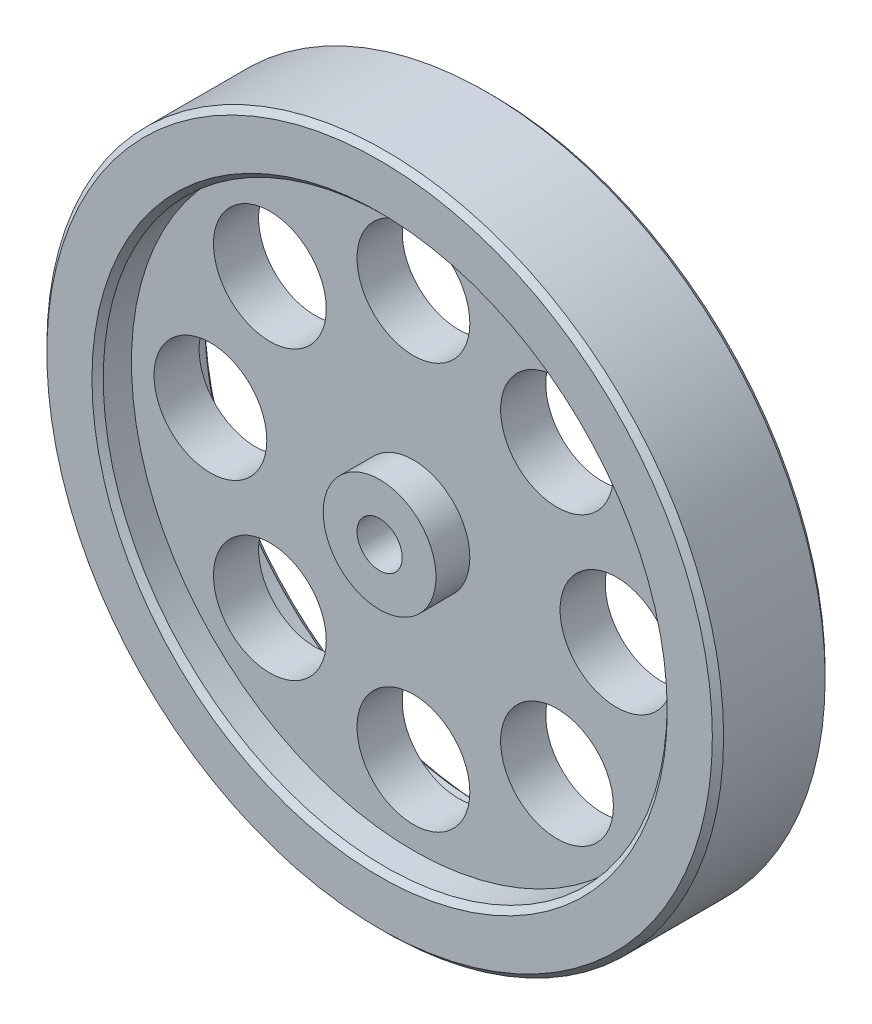
ISO-10303-21;
HEADER;
FILE_DESCRIPTION(('STEP AP214'),'2;1');
FILE_NAME('part.step','',(''),(''),'','','');
FILE_SCHEMA(('AUTOMOTIVE_DESIGN { 1 0 10303 214 1 1 1 1 }'));
ENDSEC;
DATA;
#1=APPLICATION_CONTEXT('core data for automotive mechanical design processes');
#2=APPLICATION_PROTOCOL_DEFINITION('international standard','automotive_design',2000,#1);
#3=PRODUCT_CONTEXT('',#1,'mechanical');
#4=PRODUCT('Part','Part','',(#3));
#5=PRODUCT_RELATED_PRODUCT_CATEGORY('part','',(#4));
#6=PRODUCT_DEFINITION_FORMATION('','',#4);
#7=PRODUCT_DEFINITION_CONTEXT('part definition',#1,'design');
#8=PRODUCT_DEFINITION('design','',#6,#7);
#9=PRODUCT_DEFINITION_SHAPE('','',#8);
#10=(LENGTH_UNIT() NAMED_UNIT(*) SI_UNIT(.MILLI.,.METRE.));
#11=(NAMED_UNIT(*) PLANE_ANGLE_UNIT() SI_UNIT($,.RADIAN.));
#12=(NAMED_UNIT(*) SI_UNIT($,.STERADIAN.) SOLID_ANGLE_UNIT());
#13=UNCERTAINTY_MEASURE_WITH_UNIT(LENGTH_MEASURE(1.E-05),#10,'distance_accuracy_value','');
#14=(GEOMETRIC_REPRESENTATION_CONTEXT(3) GLOBAL_UNCERTAINTY_ASSIGNED_CONTEXT((#13)) GLOBAL_UNIT_ASSIGNED_CONTEXT((#10,
#11,#12)) REPRESENTATION_CONTEXT('',''));
#15=CARTESIAN_POINT('',(0.,0.,0.));
#16=DIRECTION('',(0.,0.,1.));
#17=DIRECTION('',(1.,0.,0.));
#18=AXIS2_PLACEMENT_3D('',#15,#16,#17);
#19=CARTESIAN_POINT('',(0.,0.,5.));
#20=DIRECTION('',(0.,0.,-1.));
#21=DIRECTION('',(-1.,0.,0.));
#22=AXIS2_PLACEMENT_3D('',#19,#20,#21);
#23=CYLINDRICAL_SURFACE('',#22,25.);
#24=CARTESIAN_POINT('',(0.,0.,-4.5));
#25=DIRECTION('',(0.,0.,1.));
#26=DIRECTION('',(1.,0.,0.));
#27=AXIS2_PLACEMENT_3D('',#24,#25,#26);
#28=CIRCLE('',#27,25.);
#29=CARTESIAN_POINT('',(25.,0.,-4.5));
#30=VERTEX_POINT('',#29);
#31=EDGE_CURVE('E10',#30,#30,#28,.F.);
#32=ORIENTED_EDGE('',*,*,#31,.T.);
#33=EDGE_LOOP('',(#32));
#34=FACE_BOUND('',#33,.T.);
#35=CARTESIAN_POINT('',(0.,0.,-2.));
#36=DIRECTION('',(0.,0.,1.));
#37=DIRECTION('',(1.,0.,0.));
#38=AXIS2_PLACEMENT_3D('',#35,#36,#37);
#39=CIRCLE('',#38,25.);
#40=CARTESIAN_POINT('',(25.,0.,-2.));
#41=VERTEX_POINT('',#40);
#42=EDGE_CURVE('E102',#41,#41,#39,.T.);
#43=ORIENTED_EDGE('',*,*,#42,.T.);
#44=EDGE_LOOP('',(#43));
#45=FACE_BOUND('',#44,.T.);
#46=ADVANCED_FACE('F33',(#34,#45),#23,.F.);
#47=CARTESIAN_POINT('',(0.,0.,5.));
#48=DIRECTION('',(0.,0.,1.));
#49=DIRECTION('',(1.,0.,0.));
#50=AXIS2_PLACEMENT_3D('',#47,#48,#49);
#51=PLANE('',#50);
#52=CARTESIAN_POINT('',(0.,0.,5.));
#53=DIRECTION('',(0.,0.,1.));
#54=DIRECTION('',(1.,0.,0.));
#55=AXIS2_PLACEMENT_3D('',#52,#53,#54);
#56=CIRCLE('',#55,25.5);
#57=CARTESIAN_POINT('',(25.5,0.,5.));
#58=VERTEX_POINT('',#57);
#59=EDGE_CURVE('E57',#58,#58,#56,.F.);
#60=ORIENTED_EDGE('',*,*,#59,.T.);
#61=EDGE_LOOP('',(#60));
#62=FACE_BOUND('',#61,.T.);
#63=CARTESIAN_POINT('',(0.,0.,5.));
#64=DIRECTION('',(0.,0.,1.));
#65=DIRECTION('',(1.,0.,0.));
#66=AXIS2_PLACEMENT_3D('',#63,#64,#65);
#67=CIRCLE('',#66,29.5);
#68=CARTESIAN_POINT('',(29.5,0.,5.));
#69=VERTEX_POINT('',#68);
#70=EDGE_CURVE('E60',#69,#69,#67,.T.);
#71=ORIENTED_EDGE('',*,*,#70,.T.);
#72=EDGE_LOOP('',(#71));
#73=FACE_BOUND('',#72,.T.);
#74=ADVANCED_FACE('F160',(#62,#73),#51,.T.);
#75=CARTESIAN_POINT('',(0.,0.,-5.));
#76=DIRECTION('',(0.,0.,1.));
#77=DIRECTION('',(1.,0.,0.));
#78=AXIS2_PLACEMENT_3D('',#75,#76,#77);
#79=PLANE('',#78);
#80=CARTESIAN_POINT('',(0.,0.,-5.));
#81=DIRECTION('',(0.,0.,1.));
#82=DIRECTION('',(1.,0.,0.));
#83=AXIS2_PLACEMENT_3D('',#80,#81,#82);
#84=CIRCLE('',#83,25.5);
#85=CARTESIAN_POINT('',(25.5,0.,-5.));
#86=VERTEX_POINT('',#85);
#87=EDGE_CURVE('E41',#86,#86,#84,.T.);
#88=ORIENTED_EDGE('',*,*,#87,.T.);
#89=EDGE_LOOP('',(#88));
#90=FACE_BOUND('',#89,.T.);
#91=CARTESIAN_POINT('',(0.,0.,-5.));
#92=DIRECTION('',(0.,0.,1.));
#93=DIRECTION('',(1.,0.,0.));
#94=AXIS2_PLACEMENT_3D('',#91,#92,#93);
#95=CIRCLE('',#94,29.5);
#96=CARTESIAN_POINT('',(29.5,0.,-5.));
#97=VERTEX_POINT('',#96);
#98=EDGE_CURVE('E45',#97,#97,#95,.F.);
#99=ORIENTED_EDGE('',*,*,#98,.T.);
#100=EDGE_LOOP('',(#99));
#101=FACE_BOUND('',#100,.T.);
#102=ADVANCED_FACE('F166',(#90,#101),#79,.F.);
#103=CARTESIAN_POINT('',(0.,0.,5.));
#104=DIRECTION('',(0.,0.,-1.));
#105=DIRECTION('',(-1.,0.,0.));
#106=AXIS2_PLACEMENT_3D('',#103,#104,#105);
#107=CYLINDRICAL_SURFACE('',#106,30.);
#108=CARTESIAN_POINT('',(0.,0.,4.50000000000002));
#109=DIRECTION('',(0.,0.,1.));
#110=DIRECTION('',(1.,0.,0.));
#111=AXIS2_PLACEMENT_3D('',#108,#109,#110);
#112=CIRCLE('',#111,30.);
#113=CARTESIAN_POINT('',(30.,0.,4.50000000000002));
#114=VERTEX_POINT('',#113);
#115=EDGE_CURVE('E49',#114,#114,#112,.F.);
#116=ORIENTED_EDGE('',*,*,#115,.T.);
#117=EDGE_LOOP('',(#116));
#118=FACE_BOUND('',#117,.T.);
#119=CARTESIAN_POINT('',(0.,0.,-4.5));
#120=DIRECTION('',(0.,0.,1.));
#121=DIRECTION('',(1.,0.,0.));
#122=AXIS2_PLACEMENT_3D('',#119,#120,#121);
#123=CIRCLE('',#122,30.);
#124=CARTESIAN_POINT('',(30.,0.,-4.5));
#125=VERTEX_POINT('',#124);
#126=EDGE_CURVE('E54',#125,#125,#123,.T.);
#127=ORIENTED_EDGE('',*,*,#126,.T.);
#128=EDGE_LOOP('',(#127));
#129=FACE_BOUND('',#128,.T.);
#130=ADVANCED_FACE('F172',(#118,#129),#107,.T.);
#131=CARTESIAN_POINT('',(0.,0.,4.5));
#132=DIRECTION('',(0.,0.,1.));
#133=DIRECTION('',(1.,0.,0.));
#134=AXIS2_PLACEMENT_3D('',#131,#132,#133);
#135=CIRCLE('',#134,25.);
#136=CARTESIAN_POINT('',(25.,0.,4.5));
#137=VERTEX_POINT('',#136);
#138=EDGE_CURVE('E63',#137,#137,#135,.T.);
#139=ORIENTED_EDGE('',*,*,#138,.T.);
#140=EDGE_LOOP('',(#139));
#141=FACE_BOUND('',#140,.T.);
#142=CARTESIAN_POINT('',(0.,0.,2.));
#143=DIRECTION('',(0.,0.,1.));
#144=DIRECTION('',(1.,0.,0.));
#145=AXIS2_PLACEMENT_3D('',#142,#143,#144);
#146=CIRCLE('',#145,25.);
#147=CARTESIAN_POINT('',(25.,0.,2.));
#148=VERTEX_POINT('',#147);
#149=EDGE_CURVE('E66',#148,#148,#146,.T.);
#150=ORIENTED_EDGE('',*,*,#149,.F.);
#151=EDGE_LOOP('',(#150));
#152=FACE_BOUND('',#151,.T.);
#153=ADVANCED_FACE('F162',(#141,#152),#23,.F.);
#154=CARTESIAN_POINT('',(0.,0.,-2.));
#155=DIRECTION('',(0.,0.,1.));
#156=DIRECTION('',(1.,0.,0.));
#157=AXIS2_PLACEMENT_3D('',#154,#155,#156);
#158=PLANE('',#157);
#159=CARTESIAN_POINT('',(12.7279220613574,12.7279220613568,-2.));
#160=DIRECTION('',(0.,0.,1.));
#161=DIRECTION('',(1.,0.,0.));
#162=AXIS2_PLACEMENT_3D('',#159,#160,#161);
#163=CIRCLE('',#162,5.00000000000096);
#164=CARTESIAN_POINT('',(17.7279220613584,12.7279220613568,-2.));
#165=VERTEX_POINT('',#164);
#166=EDGE_CURVE('E70',#165,#165,#163,.T.);
#167=ORIENTED_EDGE('',*,*,#166,.T.);
#168=EDGE_LOOP('',(#167));
#169=FACE_BOUND('',#168,.T.);
#170=CARTESIAN_POINT('',(17.9999999999985,-1.53367012712258E-12,-2.));
#171=DIRECTION('',(0.,0.,1.));
#172=DIRECTION('',(1.,0.,0.));
#173=AXIS2_PLACEMENT_3D('',#170,#171,#172);
#174=CIRCLE('',#173,5.0000000000021);
#175=CARTESIAN_POINT('',(23.0000000000006,-1.53367012712258E-12,-2.));
#176=VERTEX_POINT('',#175);
#177=EDGE_CURVE('E71',#176,#176,#174,.T.);
#178=ORIENTED_EDGE('',*,*,#177,.T.);
#179=EDGE_LOOP('',(#178));
#180=FACE_BOUND('',#179,.T.);
#181=CARTESIAN_POINT('',(12.7279220613552,-12.7279220613589,-2.));
#182=DIRECTION('',(0.,0.,1.));
#183=DIRECTION('',(1.,0.,0.));
#184=AXIS2_PLACEMENT_3D('',#181,#182,#183);
#185=CIRCLE('',#184,5.00000000000297);
#186=CARTESIAN_POINT('',(17.7279220613582,-12.7279220613589,-2.));
#187=VERTEX_POINT('',#186);
#188=EDGE_CURVE('E75',#187,#187,#185,.T.);
#189=ORIENTED_EDGE('',*,*,#188,.T.);
#190=EDGE_LOOP('',(#189));
#191=FACE_BOUND('',#190,.T.);
#192=CARTESIAN_POINT('',(-3.06293152576824E-12,-18.,-2.));
#193=DIRECTION('',(0.,0.,1.));
#194=DIRECTION('',(1.,0.,0.));
#195=AXIS2_PLACEMENT_3D('',#192,#193,#194);
#196=CIRCLE('',#195,5.00000000000305);
#197=CARTESIAN_POINT('',(4.99999999999999,-18.,-2.));
#198=VERTEX_POINT('',#197);
#199=EDGE_CURVE('E79',#198,#198,#196,.T.);
#200=ORIENTED_EDGE('',*,*,#199,.T.);
#201=EDGE_LOOP('',(#200));
#202=FACE_BOUND('',#201,.T.);
#203=CARTESIAN_POINT('',(-12.7279220613605,-12.7279220613568,-2.));
#204=DIRECTION('',(0.,0.,1.));
#205=DIRECTION('',(1.,0.,0.));
#206=AXIS2_PLACEMENT_3D('',#203,#204,#205);
#207=CIRCLE('',#206,5.00000000000228);
#208=CARTESIAN_POINT('',(-7.72792206135819,-12.7279220613568,-2.));
#209=VERTEX_POINT('',#208);
#210=EDGE_CURVE('E83',#209,#209,#207,.T.);
#211=ORIENTED_EDGE('',*,*,#210,.T.);
#212=EDGE_LOOP('',(#211));
#213=FACE_BOUND('',#212,.T.);
#214=CARTESIAN_POINT('',(-18.0000000000015,1.53146576288412E-12,-2.));
#215=DIRECTION('',(0.,0.,1.));
#216=DIRECTION('',(1.,0.,0.));
#217=AXIS2_PLACEMENT_3D('',#214,#215,#216);
#218=CIRCLE('',#217,5.00000000000108);
#219=CARTESIAN_POINT('',(-13.0000000000005,1.53146576288412E-12,-2.));
#220=VERTEX_POINT('',#219);
#221=EDGE_CURVE('E87',#220,#220,#218,.T.);
#222=ORIENTED_EDGE('',*,*,#221,.T.);
#223=EDGE_LOOP('',(#222));
#224=FACE_BOUND('',#223,.T.);
#225=CARTESIAN_POINT('',(-12.7279220613583,12.7279220613589,-2.));
#226=DIRECTION('',(0.,0.,1.));
#227=DIRECTION('',(1.,0.,0.));
#228=AXIS2_PLACEMENT_3D('',#225,#226,#227);
#229=CIRCLE('',#228,5.00000000000015);
#230=CARTESIAN_POINT('',(-7.72792206135815,12.7279220613589,-2.));
#231=VERTEX_POINT('',#230);
#232=EDGE_CURVE('E91',#231,#231,#229,.T.);
#233=ORIENTED_EDGE('',*,*,#232,.T.);
#234=EDGE_LOOP('',(#233));
#235=FACE_BOUND('',#234,.T.);
#236=CARTESIAN_POINT('',(0.,18.,-2.));
#237=DIRECTION('',(0.,0.,1.));
#238=DIRECTION('',(1.,0.,0.));
#239=AXIS2_PLACEMENT_3D('',#236,#237,#238);
#240=CIRCLE('',#239,5.);
#241=CARTESIAN_POINT('',(5.,18.,-2.));
#242=VERTEX_POINT('',#241);
#243=EDGE_CURVE('E95',#242,#242,#240,.T.);
#244=ORIENTED_EDGE('',*,*,#243,.T.);
#245=EDGE_LOOP('',(#244));
#246=FACE_BOUND('',#245,.T.);
#247=CARTESIAN_POINT('',(0.,0.,-2.));
#248=DIRECTION('',(0.,0.,1.));
#249=DIRECTION('',(1.,0.,0.));
#250=AXIS2_PLACEMENT_3D('',#247,#248,#249);
#251=CIRCLE('',#250,5.);
#252=CARTESIAN_POINT('',(5.,0.,-2.));
#253=VERTEX_POINT('',#252);
#254=EDGE_CURVE('E103',#253,#253,#251,.T.);
#255=ORIENTED_EDGE('',*,*,#254,.T.);
#256=EDGE_LOOP('',(#255));
#257=FACE_BOUND('',#256,.T.);
#258=ORIENTED_EDGE('',*,*,#42,.F.);
#259=EDGE_LOOP('',(#258));
#260=FACE_BOUND('',#259,.T.);
#261=ADVANCED_FACE('F139',(#169,#180,#191,#202,#213,#224,#235,#246,#257,#260),#158,.F.);
#262=CARTESIAN_POINT('',(0.,0.,2.));
#263=DIRECTION('',(0.,0.,1.));
#264=DIRECTION('',(1.,0.,0.));
#265=AXIS2_PLACEMENT_3D('',#262,#263,#264);
#266=PLANE('',#265);
#267=CARTESIAN_POINT('',(12.7279220613574,12.7279220613568,2.));
#268=DIRECTION('',(0.,0.,1.));
#269=DIRECTION('',(1.,0.,0.));
#270=AXIS2_PLACEMENT_3D('',#267,#268,#269);
#271=CIRCLE('',#270,5.00000000000096);
#272=CARTESIAN_POINT('',(17.7279220613584,12.7279220613568,2.));
#273=VERTEX_POINT('',#272);
#274=EDGE_CURVE('E67',#273,#273,#271,.T.);
#275=ORIENTED_EDGE('',*,*,#274,.F.);
#276=EDGE_LOOP('',(#275));
#277=FACE_BOUND('',#276,.T.);
#278=CARTESIAN_POINT('',(17.9999999999985,-1.53367012712258E-12,2.));
#279=DIRECTION('',(0.,0.,1.));
#280=DIRECTION('',(1.,0.,0.));
#281=AXIS2_PLACEMENT_3D('',#278,#279,#280);
#282=CIRCLE('',#281,5.0000000000021);
#283=CARTESIAN_POINT('',(23.0000000000006,-1.53367012712258E-12,2.));
#284=VERTEX_POINT('',#283);
#285=EDGE_CURVE('E72',#284,#284,#282,.T.);
#286=ORIENTED_EDGE('',*,*,#285,.F.);
#287=EDGE_LOOP('',(#286));
#288=FACE_BOUND('',#287,.T.);
#289=CARTESIAN_POINT('',(12.7279220613552,-12.7279220613589,2.));
#290=DIRECTION('',(0.,0.,1.));
#291=DIRECTION('',(1.,0.,0.));
#292=AXIS2_PLACEMENT_3D('',#289,#290,#291);
#293=CIRCLE('',#292,5.00000000000297);
#294=CARTESIAN_POINT('',(17.7279220613582,-12.7279220613589,2.));
#295=VERTEX_POINT('',#294);
#296=EDGE_CURVE('E76',#295,#295,#293,.T.);
#297=ORIENTED_EDGE('',*,*,#296,.F.);
#298=EDGE_LOOP('',(#297));
#299=FACE_BOUND('',#298,.T.);
#300=CARTESIAN_POINT('',(-3.06293152576824E-12,-18.,2.));
#301=DIRECTION('',(0.,0.,1.));
#302=DIRECTION('',(1.,0.,0.));
#303=AXIS2_PLACEMENT_3D('',#300,#301,#302);
#304=CIRCLE('',#303,5.00000000000305);
#305=CARTESIAN_POINT('',(4.99999999999999,-18.,2.));
#306=VERTEX_POINT('',#305);
#307=EDGE_CURVE('E80',#306,#306,#304,.T.);
#308=ORIENTED_EDGE('',*,*,#307,.F.);
#309=EDGE_LOOP('',(#308));
#310=FACE_BOUND('',#309,.T.);
#311=CARTESIAN_POINT('',(-12.7279220613605,-12.7279220613568,2.));
#312=DIRECTION('',(0.,0.,1.));
#313=DIRECTION('',(1.,0.,0.));
#314=AXIS2_PLACEMENT_3D('',#311,#312,#313);
#315=CIRCLE('',#314,5.00000000000228);
#316=CARTESIAN_POINT('',(-7.72792206135819,-12.7279220613568,2.));
#317=VERTEX_POINT('',#316);
#318=EDGE_CURVE('E84',#317,#317,#315,.T.);
#319=ORIENTED_EDGE('',*,*,#318,.F.);
#320=EDGE_LOOP('',(#319));
#321=FACE_BOUND('',#320,.T.);
#322=CARTESIAN_POINT('',(-18.0000000000015,1.53146576288412E-12,2.));
#323=DIRECTION('',(0.,0.,1.));
#324=DIRECTION('',(1.,0.,0.));
#325=AXIS2_PLACEMENT_3D('',#322,#323,#324);
#326=CIRCLE('',#325,5.00000000000108);
#327=CARTESIAN_POINT('',(-13.0000000000005,1.53146576288412E-12,2.));
#328=VERTEX_POINT('',#327);
#329=EDGE_CURVE('E88',#328,#328,#326,.T.);
#330=ORIENTED_EDGE('',*,*,#329,.F.);
#331=EDGE_LOOP('',(#330));
#332=FACE_BOUND('',#331,.T.);
#333=CARTESIAN_POINT('',(-12.7279220613583,12.7279220613589,2.));
#334=DIRECTION('',(0.,0.,1.));
#335=DIRECTION('',(1.,0.,0.));
#336=AXIS2_PLACEMENT_3D('',#333,#334,#335);
#337=CIRCLE('',#336,5.00000000000015);
#338=CARTESIAN_POINT('',(-7.72792206135815,12.7279220613589,2.));
#339=VERTEX_POINT('',#338);
#340=EDGE_CURVE('E92',#339,#339,#337,.T.);
#341=ORIENTED_EDGE('',*,*,#340,.F.);
#342=EDGE_LOOP('',(#341));
#343=FACE_BOUND('',#342,.T.);
#344=CARTESIAN_POINT('',(0.,18.,2.));
#345=DIRECTION('',(0.,0.,1.));
#346=DIRECTION('',(1.,0.,0.));
#347=AXIS2_PLACEMENT_3D('',#344,#345,#346);
#348=CIRCLE('',#347,5.);
#349=CARTESIAN_POINT('',(5.,18.,2.));
#350=VERTEX_POINT('',#349);
#351=EDGE_CURVE('E96',#350,#350,#348,.T.);
#352=ORIENTED_EDGE('',*,*,#351,.F.);
#353=EDGE_LOOP('',(#352));
#354=FACE_BOUND('',#353,.T.);
#355=CARTESIAN_POINT('',(0.,0.,2.));
#356=DIRECTION('',(0.,0.,1.));
#357=DIRECTION('',(1.,0.,0.));
#358=AXIS2_PLACEMENT_3D('',#355,#356,#357);
#359=CIRCLE('',#358,5.);
#360=CARTESIAN_POINT('',(5.,0.,2.));
#361=VERTEX_POINT('',#360);
#362=EDGE_CURVE('E99',#361,#361,#359,.T.);
#363=ORIENTED_EDGE('',*,*,#362,.F.);
#364=EDGE_LOOP('',(#363));
#365=FACE_BOUND('',#364,.T.);
#366=ORIENTED_EDGE('',*,*,#149,.T.);
#367=EDGE_LOOP('',(#366));
#368=FACE_BOUND('',#367,.T.);
#369=ADVANCED_FACE('F178',(#277,#288,#299,#310,#321,#332,#343,#354,#365,#368),#266,.T.);
#370=CARTESIAN_POINT('',(0.,0.,5.));
#371=DIRECTION('',(0.,0.,-1.));
#372=DIRECTION('',(-1.,0.,0.));
#373=AXIS2_PLACEMENT_3D('',#370,#371,#372);
#374=CYLINDRICAL_SURFACE('',#373,5.);
#375=CARTESIAN_POINT('',(0.,0.,-5.));
#376=DIRECTION('',(0.,0.,-1.));
#377=DIRECTION('',(-1.,0.,0.));
#378=AXIS2_PLACEMENT_3D('',#375,#376,#377);
#379=CIRCLE('',#378,5.);
#380=CARTESIAN_POINT('',(-5.,0.,-5.));
#381=VERTEX_POINT('',#380);
#382=EDGE_CURVE('E116',#381,#381,#379,.T.);
#383=ORIENTED_EDGE('',*,*,#382,.F.);
#384=EDGE_LOOP('',(#383));
#385=FACE_BOUND('',#384,.T.);
#386=ORIENTED_EDGE('',*,*,#254,.F.);
#387=EDGE_LOOP('',(#386));
#388=FACE_BOUND('',#387,.T.);
#389=ADVANCED_FACE('F187',(#385,#388),#374,.T.);
#390=ORIENTED_EDGE('',*,*,#362,.T.);
#391=EDGE_LOOP('',(#390));
#392=FACE_BOUND('',#391,.T.);
#393=CARTESIAN_POINT('',(0.,0.,5.));
#394=DIRECTION('',(0.,0.,-1.));
#395=DIRECTION('',(-1.,0.,0.));
#396=AXIS2_PLACEMENT_3D('',#393,#394,#395);
#397=CIRCLE('',#396,5.);
#398=CARTESIAN_POINT('',(-5.,0.,5.));
#399=VERTEX_POINT('',#398);
#400=EDGE_CURVE('E110',#399,#399,#397,.T.);
#401=ORIENTED_EDGE('',*,*,#400,.T.);
#402=EDGE_LOOP('',(#401));
#403=FACE_BOUND('',#402,.T.);
#404=ADVANCED_FACE('F193',(#392,#403),#374,.T.);
#405=CARTESIAN_POINT('',(0.,0.,5.));
#406=DIRECTION('',(0.,0.,-1.));
#407=DIRECTION('',(-1.,0.,0.));
#408=AXIS2_PLACEMENT_3D('',#405,#406,#407);
#409=PLANE('',#408);
#410=CARTESIAN_POINT('',(0.,0.,5.));
#411=DIRECTION('',(0.,0.,-1.));
#412=DIRECTION('',(-1.,0.,0.));
#413=AXIS2_PLACEMENT_3D('',#410,#411,#412);
#414=CIRCLE('',#413,2.);
#415=CARTESIAN_POINT('',(-2.,0.,5.));
#416=VERTEX_POINT('',#415);
#417=EDGE_CURVE('E113',#416,#416,#414,.T.);
#418=ORIENTED_EDGE('',*,*,#417,.T.);
#419=EDGE_LOOP('',(#418));
#420=FACE_BOUND('',#419,.T.);
#421=ORIENTED_EDGE('',*,*,#400,.F.);
#422=EDGE_LOOP('',(#421));
#423=FACE_BOUND('',#422,.T.);
#424=ADVANCED_FACE('F200',(#420,#423),#409,.F.);
#425=CARTESIAN_POINT('',(0.,0.,5.));
#426=DIRECTION('',(0.,0.,-1.));
#427=DIRECTION('',(-1.,0.,0.));
#428=AXIS2_PLACEMENT_3D('',#425,#426,#427);
#429=CYLINDRICAL_SURFACE('',#428,2.);
#430=ORIENTED_EDGE('',*,*,#417,.F.);
#431=EDGE_LOOP('',(#430));
#432=FACE_BOUND('',#431,.T.);
#433=CARTESIAN_POINT('',(0.,0.,-5.));
#434=DIRECTION('',(0.,0.,-1.));
#435=DIRECTION('',(-1.,0.,0.));
#436=AXIS2_PLACEMENT_3D('',#433,#434,#435);
#437=CIRCLE('',#436,2.);
#438=CARTESIAN_POINT('',(-2.,0.,-5.));
#439=VERTEX_POINT('',#438);
#440=EDGE_CURVE('E119',#439,#439,#437,.T.);
#441=ORIENTED_EDGE('',*,*,#440,.T.);
#442=EDGE_LOOP('',(#441));
#443=FACE_BOUND('',#442,.T.);
#444=ADVANCED_FACE('F155',(#432,#443),#429,.F.);
#445=CARTESIAN_POINT('',(0.,0.,-5.));
#446=DIRECTION('',(0.,0.,-1.));
#447=DIRECTION('',(-1.,0.,0.));
#448=AXIS2_PLACEMENT_3D('',#445,#446,#447);
#449=PLANE('',#448);
#450=ORIENTED_EDGE('',*,*,#382,.T.);
#451=EDGE_LOOP('',(#450));
#452=FACE_BOUND('',#451,.T.);
#453=ORIENTED_EDGE('',*,*,#440,.F.);
#454=EDGE_LOOP('',(#453));
#455=FACE_BOUND('',#454,.T.);
#456=ADVANCED_FACE('F145',(#452,#455),#449,.T.);
#457=CARTESIAN_POINT('',(0.,18.,5.));
#458=DIRECTION('',(0.,0.,-1.));
#459=DIRECTION('',(-1.,0.,0.));
#460=AXIS2_PLACEMENT_3D('',#457,#458,#459);
#461=CYLINDRICAL_SURFACE('',#460,5.);
#462=ORIENTED_EDGE('',*,*,#351,.T.);
#463=EDGE_LOOP('',(#462));
#464=FACE_BOUND('',#463,.T.);
#465=ORIENTED_EDGE('',*,*,#243,.F.);
#466=EDGE_LOOP('',(#465));
#467=FACE_BOUND('',#466,.T.);
#468=ADVANCED_FACE('F142',(#464,#467),#461,.F.);
#469=CARTESIAN_POINT('',(-12.7279220613583,12.7279220613589,5.));
#470=DIRECTION('',(0.,0.,-1.));
#471=DIRECTION('',(-1.,0.,0.));
#472=AXIS2_PLACEMENT_3D('',#469,#470,#471);
#473=CYLINDRICAL_SURFACE('',#472,5.00000000000015);
#474=ORIENTED_EDGE('',*,*,#340,.T.);
#475=EDGE_LOOP('',(#474));
#476=FACE_BOUND('',#475,.T.);
#477=ORIENTED_EDGE('',*,*,#232,.F.);
#478=EDGE_LOOP('',(#477));
#479=FACE_BOUND('',#478,.T.);
#480=ADVANCED_FACE('F144',(#476,#479),#473,.F.);
#481=CARTESIAN_POINT('',(-18.0000000000015,1.53146576288412E-12,5.));
#482=DIRECTION('',(0.,0.,-1.));
#483=DIRECTION('',(-1.,0.,0.));
#484=AXIS2_PLACEMENT_3D('',#481,#482,#483);
#485=CYLINDRICAL_SURFACE('',#484,5.00000000000108);
#486=ORIENTED_EDGE('',*,*,#329,.T.);
#487=EDGE_LOOP('',(#486));
#488=FACE_BOUND('',#487,.T.);
#489=ORIENTED_EDGE('',*,*,#221,.F.);
#490=EDGE_LOOP('',(#489));
#491=FACE_BOUND('',#490,.T.);
#492=ADVANCED_FACE('F152',(#488,#491),#485,.F.);
#493=CARTESIAN_POINT('',(-12.7279220613605,-12.7279220613568,5.));
#494=DIRECTION('',(0.,0.,-1.));
#495=DIRECTION('',(-1.,0.,0.));
#496=AXIS2_PLACEMENT_3D('',#493,#494,#495);
#497=CYLINDRICAL_SURFACE('',#496,5.00000000000228);
#498=ORIENTED_EDGE('',*,*,#318,.T.);
#499=EDGE_LOOP('',(#498));
#500=FACE_BOUND('',#499,.T.);
#501=ORIENTED_EDGE('',*,*,#210,.F.);
#502=EDGE_LOOP('',(#501));
#503=FACE_BOUND('',#502,.T.);
#504=ADVANCED_FACE('F253',(#500,#503),#497,.F.);
#505=CARTESIAN_POINT('',(-3.06293152576824E-12,-18.,5.));
#506=DIRECTION('',(0.,0.,-1.));
#507=DIRECTION('',(-1.,0.,0.));
#508=AXIS2_PLACEMENT_3D('',#505,#506,#507);
#509=CYLINDRICAL_SURFACE('',#508,5.00000000000305);
#510=ORIENTED_EDGE('',*,*,#307,.T.);
#511=EDGE_LOOP('',(#510));
#512=FACE_BOUND('',#511,.T.);
#513=ORIENTED_EDGE('',*,*,#199,.F.);
#514=EDGE_LOOP('',(#513));
#515=FACE_BOUND('',#514,.T.);
#516=ADVANCED_FACE('F263',(#512,#515),#509,.F.);
#517=CARTESIAN_POINT('',(12.7279220613552,-12.7279220613589,5.));
#518=DIRECTION('',(0.,0.,-1.));
#519=DIRECTION('',(-1.,0.,0.));
#520=AXIS2_PLACEMENT_3D('',#517,#518,#519);
#521=CYLINDRICAL_SURFACE('',#520,5.00000000000297);
#522=ORIENTED_EDGE('',*,*,#296,.T.);
#523=EDGE_LOOP('',(#522));
#524=FACE_BOUND('',#523,.T.);
#525=ORIENTED_EDGE('',*,*,#188,.F.);
#526=EDGE_LOOP('',(#525));
#527=FACE_BOUND('',#526,.T.);
#528=ADVANCED_FACE('F273',(#524,#527),#521,.F.);
#529=CARTESIAN_POINT('',(17.9999999999985,-1.53367012712258E-12,5.));
#530=DIRECTION('',(0.,0.,-1.));
#531=DIRECTION('',(-1.,0.,0.));
#532=AXIS2_PLACEMENT_3D('',#529,#530,#531);
#533=CYLINDRICAL_SURFACE('',#532,5.0000000000021);
#534=ORIENTED_EDGE('',*,*,#285,.T.);
#535=EDGE_LOOP('',(#534));
#536=FACE_BOUND('',#535,.T.);
#537=ORIENTED_EDGE('',*,*,#177,.F.);
#538=EDGE_LOOP('',(#537));
#539=FACE_BOUND('',#538,.T.);
#540=ADVANCED_FACE('F283',(#536,#539),#533,.F.);
#541=CARTESIAN_POINT('',(12.7279220613574,12.7279220613568,5.));
#542=DIRECTION('',(0.,0.,-1.));
#543=DIRECTION('',(-1.,0.,0.));
#544=AXIS2_PLACEMENT_3D('',#541,#542,#543);
#545=CYLINDRICAL_SURFACE('',#544,5.00000000000096);
#546=ORIENTED_EDGE('',*,*,#274,.T.);
#547=EDGE_LOOP('',(#546));
#548=FACE_BOUND('',#547,.T.);
#549=ORIENTED_EDGE('',*,*,#166,.F.);
#550=EDGE_LOOP('',(#549));
#551=FACE_BOUND('',#550,.T.);
#552=ADVANCED_FACE('F293',(#548,#551),#545,.F.);
#553=CARTESIAN_POINT('',(0.,0.,4.5));
#554=DIRECTION('',(0.,0.,1.));
#555=DIRECTION('',(1.,0.,0.));
#556=AXIS2_PLACEMENT_3D('',#553,#554,#555);
#557=CONICAL_SURFACE('',#556,25.,0.785398163397445);
#558=ORIENTED_EDGE('',*,*,#59,.F.);
#559=EDGE_LOOP('',(#558));
#560=FACE_BOUND('',#559,.T.);
#561=ORIENTED_EDGE('',*,*,#138,.F.);
#562=EDGE_LOOP('',(#561));
#563=FACE_BOUND('',#562,.T.);
#564=ADVANCED_FACE('F302',(#560,#563),#557,.F.);
#565=CARTESIAN_POINT('',(0.,0.,5.));
#566=DIRECTION('',(0.,0.,-1.));
#567=DIRECTION('',(-1.,0.,0.));
#568=AXIS2_PLACEMENT_3D('',#565,#566,#567);
#569=CONICAL_SURFACE('',#568,29.5,0.785398163397448);
#570=ORIENTED_EDGE('',*,*,#115,.F.);
#571=EDGE_LOOP('',(#570));
#572=FACE_BOUND('',#571,.T.);
#573=ORIENTED_EDGE('',*,*,#70,.F.);
#574=EDGE_LOOP('',(#573));
#575=FACE_BOUND('',#574,.T.);
#576=ADVANCED_FACE('F339',(#572,#575),#569,.T.);
#577=CARTESIAN_POINT('',(0.,0.,-5.));
#578=DIRECTION('',(0.,0.,-1.));
#579=DIRECTION('',(-1.,0.,0.));
#580=AXIS2_PLACEMENT_3D('',#577,#578,#579);
#581=CONICAL_SURFACE('',#580,25.5,0.785398163397445);
#582=ORIENTED_EDGE('',*,*,#31,.F.);
#583=EDGE_LOOP('',(#582));
#584=FACE_BOUND('',#583,.T.);
#585=ORIENTED_EDGE('',*,*,#87,.F.);
#586=EDGE_LOOP('',(#585));
#587=FACE_BOUND('',#586,.T.);
#588=ADVANCED_FACE('F349',(#584,#587),#581,.F.);
#589=CARTESIAN_POINT('',(0.,0.,-4.5));
#590=DIRECTION('',(0.,0.,1.));
#591=DIRECTION('',(1.,0.,0.));
#592=AXIS2_PLACEMENT_3D('',#589,#590,#591);
#593=CONICAL_SURFACE('',#592,30.,0.785398163397448);
#594=ORIENTED_EDGE('',*,*,#98,.F.);
#595=EDGE_LOOP('',(#594));
#596=FACE_BOUND('',#595,.T.);
#597=ORIENTED_EDGE('',*,*,#126,.F.);
#598=EDGE_LOOP('',(#597));
#599=FACE_BOUND('',#598,.T.);
#600=ADVANCED_FACE('F36',(#596,#599),#593,.T.);
#601=CLOSED_SHELL('',(#46,#74,#102,#130,#153,#261,#369,#389,#404,#424,#444,#456,#468,#480,#492,
#504,#516,#528,#540,#552,#564,#576,#588,#600));
#602=MANIFOLD_SOLID_BREP('B2',#601);
#603=ADVANCED_BREP_SHAPE_REPRESENTATION('',(#18,#602),#14);
#604=SHAPE_DEFINITION_REPRESENTATION(#9,#603);
ENDSEC;
END-ISO-10303-21;
